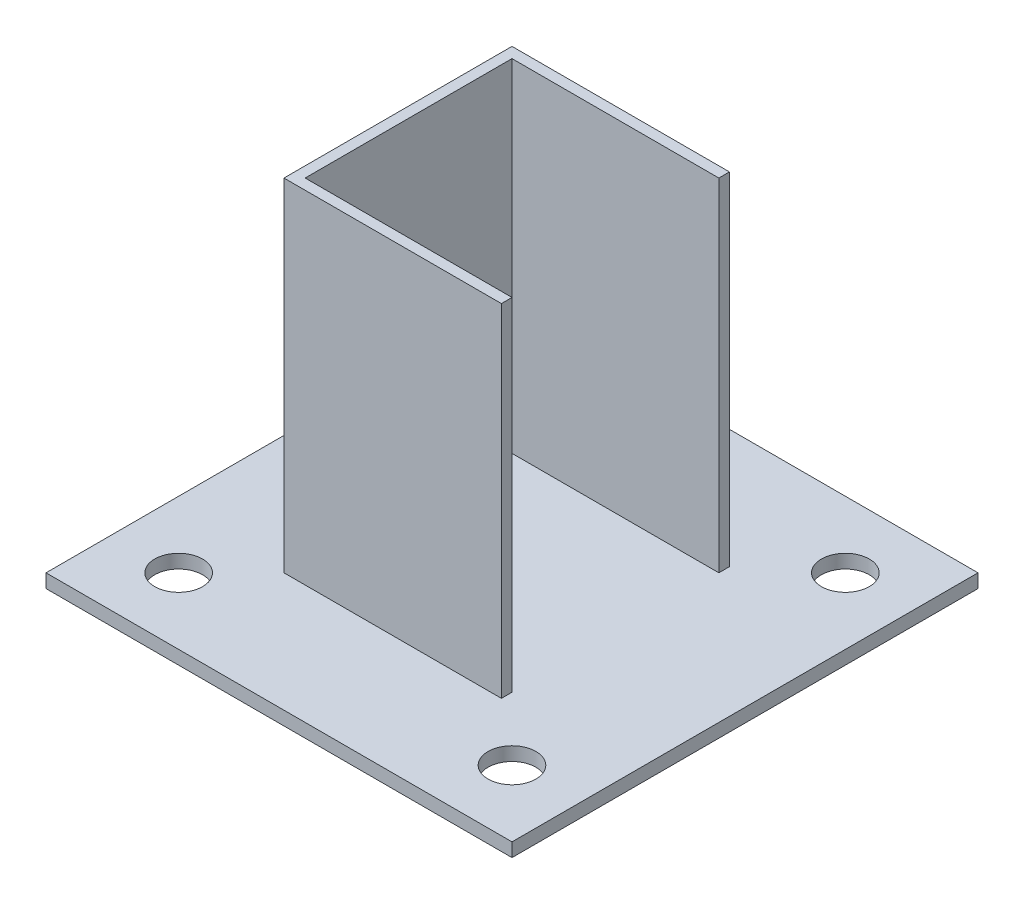
ISO-10303-21;
HEADER;
FILE_DESCRIPTION(('STEP AP214'),'2;1');
FILE_NAME('part.step','',(''),(''),'','','');
FILE_SCHEMA(('AUTOMOTIVE_DESIGN { 1 0 10303 214 1 1 1 1 }'));
ENDSEC;
DATA;
#1=APPLICATION_CONTEXT('core data for automotive mechanical design processes');
#2=APPLICATION_PROTOCOL_DEFINITION('international standard','automotive_design',2000,#1);
#3=PRODUCT_CONTEXT('',#1,'mechanical');
#4=PRODUCT('Part','Part','',(#3));
#5=PRODUCT_RELATED_PRODUCT_CATEGORY('part','',(#4));
#6=PRODUCT_DEFINITION_FORMATION('','',#4);
#7=PRODUCT_DEFINITION_CONTEXT('part definition',#1,'design');
#8=PRODUCT_DEFINITION('design','',#6,#7);
#9=PRODUCT_DEFINITION_SHAPE('','',#8);
#10=(LENGTH_UNIT() NAMED_UNIT(*) SI_UNIT(.MILLI.,.METRE.));
#11=(NAMED_UNIT(*) PLANE_ANGLE_UNIT() SI_UNIT($,.RADIAN.));
#12=(NAMED_UNIT(*) SI_UNIT($,.STERADIAN.) SOLID_ANGLE_UNIT());
#13=UNCERTAINTY_MEASURE_WITH_UNIT(LENGTH_MEASURE(1.E-05),#10,'distance_accuracy_value','');
#14=(GEOMETRIC_REPRESENTATION_CONTEXT(3) GLOBAL_UNCERTAINTY_ASSIGNED_CONTEXT((#13)) GLOBAL_UNIT_ASSIGNED_CONTEXT((#10,
#11,#12)) REPRESENTATION_CONTEXT('',''));
#15=CARTESIAN_POINT('',(0.,0.,0.));
#16=DIRECTION('',(0.,0.,1.));
#17=DIRECTION('',(1.,0.,0.));
#18=AXIS2_PLACEMENT_3D('',#15,#16,#17);
#19=CARTESIAN_POINT('',(-33.35,104.,1.55));
#20=DIRECTION('',(0.,0.,-1.));
#21=DIRECTION('',(-1.,0.,0.));
#22=AXIS2_PLACEMENT_3D('',#19,#20,#21);
#23=PLANE('',#22);
#24=DIRECTION('',(0.409248529410093,0.912422950815945,0.));
#25=VECTOR('',#24,1.);
#26=CARTESIAN_POINT('',(-63.85,4.,1.55));
#27=LINE('',#26,#25);
#28=CARTESIAN_POINT('',(-63.85,4.,1.55));
#29=VERTEX_POINT('',#28);
#30=CARTESIAN_POINT('',(-33.35,72.,1.55));
#31=VERTEX_POINT('',#30);
#32=EDGE_CURVE('E150',#29,#31,#27,.T.);
#33=ORIENTED_EDGE('',*,*,#32,.F.);
#34=DIRECTION('',(1.,0.,0.));
#35=VECTOR('',#34,1.);
#36=CARTESIAN_POINT('',(-33.35,4.,1.55));
#37=LINE('',#36,#35);
#38=CARTESIAN_POINT('',(-33.35,4.,1.55));
#39=VERTEX_POINT('',#38);
#40=EDGE_CURVE('E152',#29,#39,#37,.T.);
#41=ORIENTED_EDGE('',*,*,#40,.T.);
#42=DIRECTION('',(0.,-1.,0.));
#43=VECTOR('',#42,1.);
#44=CARTESIAN_POINT('',(-33.35,104.,1.55));
#45=LINE('',#44,#43);
#46=EDGE_CURVE('E156',#31,#39,#45,.T.);
#47=ORIENTED_EDGE('',*,*,#46,.F.);
#48=EDGE_LOOP('',(#33,#41,#47));
#49=FACE_BOUND('',#48,.T.);
#50=ADVANCED_FACE('F39',(#49),#23,.F.);
#51=CARTESIAN_POINT('',(68.15,4.,-68.15));
#52=DIRECTION('',(-1.,0.,0.));
#53=DIRECTION('',(0.,0.,1.));
#54=AXIS2_PLACEMENT_3D('',#51,#52,#53);
#55=PLANE('',#54);
#56=DIRECTION('',(0.,0.,-1.));
#57=VECTOR('',#56,1.);
#58=CARTESIAN_POINT('',(68.15,0.,-68.15));
#59=LINE('',#58,#57);
#60=CARTESIAN_POINT('',(68.15,0.,68.15));
#61=VERTEX_POINT('',#60);
#62=CARTESIAN_POINT('',(68.15,0.,-68.15));
#63=VERTEX_POINT('',#62);
#64=EDGE_CURVE('E208',#61,#63,#59,.T.);
#65=ORIENTED_EDGE('',*,*,#64,.T.);
#66=DIRECTION('',(0.,-1.,0.));
#67=VECTOR('',#66,1.);
#68=CARTESIAN_POINT('',(68.15,4.,-68.15));
#69=LINE('',#68,#67);
#70=CARTESIAN_POINT('',(68.15,4.,-68.15));
#71=VERTEX_POINT('',#70);
#72=EDGE_CURVE('E48',#71,#63,#69,.T.);
#73=ORIENTED_EDGE('',*,*,#72,.F.);
#74=DIRECTION('',(0.,0.,-1.));
#75=VECTOR('',#74,1.);
#76=CARTESIAN_POINT('',(68.15,4.,-68.15));
#77=LINE('',#76,#75);
#78=CARTESIAN_POINT('',(68.15,4.,68.15));
#79=VERTEX_POINT('',#78);
#80=EDGE_CURVE('E212',#79,#71,#77,.T.);
#81=ORIENTED_EDGE('',*,*,#80,.F.);
#82=DIRECTION('',(0.,-1.,0.));
#83=VECTOR('',#82,1.);
#84=CARTESIAN_POINT('',(68.15,4.,68.15));
#85=LINE('',#84,#83);
#86=EDGE_CURVE('E224',#79,#61,#85,.T.);
#87=ORIENTED_EDGE('',*,*,#86,.T.);
#88=EDGE_LOOP('',(#65,#73,#81,#87));
#89=FACE_BOUND('',#88,.T.);
#90=ADVANCED_FACE('F41',(#89),#55,.F.);
#91=CARTESIAN_POINT('',(-68.15,4.,-68.15));
#92=DIRECTION('',(0.,0.,1.));
#93=DIRECTION('',(1.,0.,0.));
#94=AXIS2_PLACEMENT_3D('',#91,#92,#93);
#95=PLANE('',#94);
#96=DIRECTION('',(-1.,0.,0.));
#97=VECTOR('',#96,1.);
#98=CARTESIAN_POINT('',(-68.15,0.,-68.15));
#99=LINE('',#98,#97);
#100=CARTESIAN_POINT('',(-68.15,0.,-68.15));
#101=VERTEX_POINT('',#100);
#102=EDGE_CURVE('E223',#63,#101,#99,.T.);
#103=ORIENTED_EDGE('',*,*,#102,.T.);
#104=DIRECTION('',(0.,-1.,0.));
#105=VECTOR('',#104,1.);
#106=CARTESIAN_POINT('',(-68.15,4.,-68.15));
#107=LINE('',#106,#105);
#108=CARTESIAN_POINT('',(-68.15,4.,-68.15));
#109=VERTEX_POINT('',#108);
#110=EDGE_CURVE('E234',#109,#101,#107,.T.);
#111=ORIENTED_EDGE('',*,*,#110,.F.);
#112=DIRECTION('',(-1.,0.,0.));
#113=VECTOR('',#112,1.);
#114=CARTESIAN_POINT('',(-68.15,4.,-68.15));
#115=LINE('',#114,#113);
#116=EDGE_CURVE('E211',#71,#109,#115,.T.);
#117=ORIENTED_EDGE('',*,*,#116,.F.);
#118=ORIENTED_EDGE('',*,*,#72,.T.);
#119=EDGE_LOOP('',(#103,#111,#117,#118));
#120=FACE_BOUND('',#119,.T.);
#121=ADVANCED_FACE('F272',(#120),#95,.F.);
#122=CARTESIAN_POINT('',(-68.15,4.,-68.15));
#123=DIRECTION('',(1.,0.,0.));
#124=DIRECTION('',(0.,0.,-1.));
#125=AXIS2_PLACEMENT_3D('',#122,#123,#124);
#126=PLANE('',#125);
#127=DIRECTION('',(0.,0.,1.));
#128=VECTOR('',#127,1.);
#129=CARTESIAN_POINT('',(-68.15,0.,-68.15));
#130=LINE('',#129,#128);
#131=CARTESIAN_POINT('',(-68.15,0.,68.15));
#132=VERTEX_POINT('',#131);
#133=EDGE_CURVE('E228',#101,#132,#130,.T.);
#134=ORIENTED_EDGE('',*,*,#133,.T.);
#135=DIRECTION('',(0.,-1.,0.));
#136=VECTOR('',#135,1.);
#137=CARTESIAN_POINT('',(-68.15,4.,68.15));
#138=LINE('',#137,#136);
#139=CARTESIAN_POINT('',(-68.15,4.,68.15));
#140=VERTEX_POINT('',#139);
#141=EDGE_CURVE('E232',#140,#132,#138,.T.);
#142=ORIENTED_EDGE('',*,*,#141,.F.);
#143=DIRECTION('',(0.,0.,1.));
#144=VECTOR('',#143,1.);
#145=CARTESIAN_POINT('',(-68.15,4.,-68.15));
#146=LINE('',#145,#144);
#147=EDGE_CURVE('E216',#109,#140,#146,.T.);
#148=ORIENTED_EDGE('',*,*,#147,.F.);
#149=ORIENTED_EDGE('',*,*,#110,.T.);
#150=EDGE_LOOP('',(#134,#142,#148,#149));
#151=FACE_BOUND('',#150,.T.);
#152=ADVANCED_FACE('F305',(#151),#126,.F.);
#153=CARTESIAN_POINT('',(-68.15,4.,68.15));
#154=DIRECTION('',(0.,0.,-1.));
#155=DIRECTION('',(-1.,0.,0.));
#156=AXIS2_PLACEMENT_3D('',#153,#154,#155);
#157=PLANE('',#156);
#158=DIRECTION('',(1.,0.,0.));
#159=VECTOR('',#158,1.);
#160=CARTESIAN_POINT('',(-68.15,0.,68.15));
#161=LINE('',#160,#159);
#162=EDGE_CURVE('E213',#132,#61,#161,.T.);
#163=ORIENTED_EDGE('',*,*,#162,.T.);
#164=ORIENTED_EDGE('',*,*,#86,.F.);
#165=DIRECTION('',(1.,0.,0.));
#166=VECTOR('',#165,1.);
#167=CARTESIAN_POINT('',(-68.15,4.,68.15));
#168=LINE('',#167,#166);
#169=EDGE_CURVE('E218',#140,#79,#168,.T.);
#170=ORIENTED_EDGE('',*,*,#169,.F.);
#171=ORIENTED_EDGE('',*,*,#141,.T.);
#172=EDGE_LOOP('',(#163,#164,#170,#171));
#173=FACE_BOUND('',#172,.T.);
#174=ADVANCED_FACE('F300',(#173),#157,.F.);
#175=CARTESIAN_POINT('',(0.,4.,0.));
#176=DIRECTION('',(0.,1.,0.));
#177=DIRECTION('',(0.,0.,1.));
#178=AXIS2_PLACEMENT_3D('',#175,#176,#177);
#179=PLANE('',#178);
#180=CARTESIAN_POINT('',(-48.7499999999995,4.,-48.7500000000005));
#181=DIRECTION('',(0.,1.,0.));
#182=DIRECTION('',(0.,0.,1.));
#183=AXIS2_PLACEMENT_3D('',#180,#181,#182);
#184=CIRCLE('',#183,7.);
#185=CARTESIAN_POINT('',(-48.7499999999995,4.,-41.7500000000005));
#186=VERTEX_POINT('',#185);
#187=EDGE_CURVE('E529',#186,#186,#184,.T.);
#188=ORIENTED_EDGE('',*,*,#187,.F.);
#189=EDGE_LOOP('',(#188));
#190=FACE_BOUND('',#189,.T.);
#191=CARTESIAN_POINT('',(-48.7500000000004,4.,48.7499999999996));
#192=DIRECTION('',(0.,1.,0.));
#193=DIRECTION('',(0.,0.,1.));
#194=AXIS2_PLACEMENT_3D('',#191,#192,#193);
#195=CIRCLE('',#194,7.);
#196=CARTESIAN_POINT('',(-48.7500000000004,4.,55.7499999999996));
#197=VERTEX_POINT('',#196);
#198=EDGE_CURVE('E530',#197,#197,#195,.T.);
#199=ORIENTED_EDGE('',*,*,#198,.F.);
#200=EDGE_LOOP('',(#199));
#201=FACE_BOUND('',#200,.T.);
#202=CARTESIAN_POINT('',(48.7499999999998,4.,48.7500000000002));
#203=DIRECTION('',(0.,1.,0.));
#204=DIRECTION('',(0.,0.,1.));
#205=AXIS2_PLACEMENT_3D('',#202,#203,#204);
#206=CIRCLE('',#205,7.);
#207=CARTESIAN_POINT('',(48.7499999999998,4.,55.7500000000002));
#208=VERTEX_POINT('',#207);
#209=EDGE_CURVE('E528',#208,#208,#206,.T.);
#210=ORIENTED_EDGE('',*,*,#209,.F.);
#211=EDGE_LOOP('',(#210));
#212=FACE_BOUND('',#211,.T.);
#213=CARTESIAN_POINT('',(48.75,4.,-48.75));
#214=DIRECTION('',(0.,1.,0.));
#215=DIRECTION('',(0.,0.,1.));
#216=AXIS2_PLACEMENT_3D('',#213,#214,#215);
#217=CIRCLE('',#216,7.);
#218=CARTESIAN_POINT('',(48.75,4.,-41.75));
#219=VERTEX_POINT('',#218);
#220=EDGE_CURVE('E245',#219,#219,#217,.T.);
#221=ORIENTED_EDGE('',*,*,#220,.F.);
#222=EDGE_LOOP('',(#221));
#223=FACE_BOUND('',#222,.T.);
#224=ORIENTED_EDGE('',*,*,#116,.T.);
#225=ORIENTED_EDGE('',*,*,#147,.T.);
#226=ORIENTED_EDGE('',*,*,#169,.T.);
#227=ORIENTED_EDGE('',*,*,#80,.T.);
#228=EDGE_LOOP('',(#224,#225,#226,#227));
#229=FACE_BOUND('',#228,.T.);
#230=DIRECTION('',(0.,0.,-1.));
#231=VECTOR('',#230,1.);
#232=CARTESIAN_POINT('',(30.25,4.,-33.35));
#233=LINE('',#232,#231);
#234=CARTESIAN_POINT('',(30.25,4.,-30.25));
#235=VERTEX_POINT('',#234);
#236=CARTESIAN_POINT('',(30.25,4.,-33.35));
#237=VERTEX_POINT('',#236);
#238=EDGE_CURVE('E64',#235,#237,#233,.T.);
#239=ORIENTED_EDGE('',*,*,#238,.F.);
#240=DIRECTION('',(1.,0.,0.));
#241=VECTOR('',#240,1.);
#242=CARTESIAN_POINT('',(30.25,4.,-30.25));
#243=LINE('',#242,#241);
#244=CARTESIAN_POINT('',(-30.25,4.,-30.25));
#245=VERTEX_POINT('',#244);
#246=EDGE_CURVE('E176',#245,#235,#243,.T.);
#247=ORIENTED_EDGE('',*,*,#246,.F.);
#248=DIRECTION('',(0.,0.,-1.));
#249=VECTOR('',#248,1.);
#250=CARTESIAN_POINT('',(-30.25,4.,-30.25));
#251=LINE('',#250,#249);
#252=CARTESIAN_POINT('',(-30.25,4.,30.25));
#253=VERTEX_POINT('',#252);
#254=EDGE_CURVE('E179',#253,#245,#251,.T.);
#255=ORIENTED_EDGE('',*,*,#254,.F.);
#256=DIRECTION('',(-1.,0.,0.));
#257=VECTOR('',#256,1.);
#258=CARTESIAN_POINT('',(-30.25,4.,30.25));
#259=LINE('',#258,#257);
#260=CARTESIAN_POINT('',(30.25,4.,30.25));
#261=VERTEX_POINT('',#260);
#262=EDGE_CURVE('E173',#261,#253,#259,.T.);
#263=ORIENTED_EDGE('',*,*,#262,.F.);
#264=DIRECTION('',(0.,0.,-1.));
#265=VECTOR('',#264,1.);
#266=CARTESIAN_POINT('',(30.25,4.,30.25));
#267=LINE('',#266,#265);
#268=CARTESIAN_POINT('',(30.25,4.,33.35));
#269=VERTEX_POINT('',#268);
#270=EDGE_CURVE('E174',#269,#261,#267,.T.);
#271=ORIENTED_EDGE('',*,*,#270,.F.);
#272=DIRECTION('',(1.,0.,0.));
#273=VECTOR('',#272,1.);
#274=CARTESIAN_POINT('',(30.25,4.,33.35));
#275=LINE('',#274,#273);
#276=CARTESIAN_POINT('',(-33.35,4.,33.35));
#277=VERTEX_POINT('',#276);
#278=EDGE_CURVE('E163',#277,#269,#275,.T.);
#279=ORIENTED_EDGE('',*,*,#278,.F.);
#280=DIRECTION('',(0.,0.,1.));
#281=VECTOR('',#280,1.);
#282=CARTESIAN_POINT('',(-33.35,4.,33.35));
#283=LINE('',#282,#281);
#284=EDGE_CURVE('E164',#39,#277,#283,.T.);
#285=ORIENTED_EDGE('',*,*,#284,.F.);
#286=ORIENTED_EDGE('',*,*,#40,.F.);
#287=DIRECTION('',(0.,0.,1.));
#288=VECTOR('',#287,1.);
#289=CARTESIAN_POINT('',(-63.85,4.,-1.54999999999999));
#290=LINE('',#289,#288);
#291=CARTESIAN_POINT('',(-63.85,4.,-1.55));
#292=VERTEX_POINT('',#291);
#293=EDGE_CURVE('E142',#292,#29,#290,.T.);
#294=ORIENTED_EDGE('',*,*,#293,.F.);
#295=DIRECTION('',(-1.,0.,0.));
#296=VECTOR('',#295,1.);
#297=CARTESIAN_POINT('',(-33.35,4.,-1.55));
#298=LINE('',#297,#296);
#299=CARTESIAN_POINT('',(-33.35,4.,-1.55));
#300=VERTEX_POINT('',#299);
#301=EDGE_CURVE('E155',#300,#292,#298,.T.);
#302=ORIENTED_EDGE('',*,*,#301,.F.);
#303=DIRECTION('',(0.,0.,1.));
#304=VECTOR('',#303,1.);
#305=CARTESIAN_POINT('',(-33.35,4.,-1.55));
#306=LINE('',#305,#304);
#307=CARTESIAN_POINT('',(-33.35,4.,-33.35));
#308=VERTEX_POINT('',#307);
#309=EDGE_CURVE('E504',#308,#300,#306,.T.);
#310=ORIENTED_EDGE('',*,*,#309,.F.);
#311=DIRECTION('',(-1.,0.,0.));
#312=VECTOR('',#311,1.);
#313=CARTESIAN_POINT('',(-33.35,4.,-33.35));
#314=LINE('',#313,#312);
#315=EDGE_CURVE('E505',#237,#308,#314,.T.);
#316=ORIENTED_EDGE('',*,*,#315,.F.);
#317=EDGE_LOOP('',(#239,#247,#255,#263,#271,#279,#285,#286,#294,#302,#310,#316));
#318=FACE_BOUND('',#317,.T.);
#319=ADVANCED_FACE('F162',(#190,#201,#212,#223,#229,#318),#179,.T.);
#320=CARTESIAN_POINT('',(0.,0.,0.));
#321=DIRECTION('',(0.,1.,0.));
#322=DIRECTION('',(0.,0.,1.));
#323=AXIS2_PLACEMENT_3D('',#320,#321,#322);
#324=PLANE('',#323);
#325=CARTESIAN_POINT('',(-48.7499999999995,0.,-48.7500000000005));
#326=DIRECTION('',(0.,1.,0.));
#327=DIRECTION('',(0.,0.,1.));
#328=AXIS2_PLACEMENT_3D('',#325,#326,#327);
#329=CIRCLE('',#328,7.);
#330=CARTESIAN_POINT('',(-48.7499999999995,0.,-41.7500000000005));
#331=VERTEX_POINT('',#330);
#332=EDGE_CURVE('E43',#331,#331,#329,.T.);
#333=ORIENTED_EDGE('',*,*,#332,.T.);
#334=EDGE_LOOP('',(#333));
#335=FACE_BOUND('',#334,.T.);
#336=CARTESIAN_POINT('',(-48.7500000000004,0.,48.7499999999996));
#337=DIRECTION('',(0.,1.,0.));
#338=DIRECTION('',(0.,0.,1.));
#339=AXIS2_PLACEMENT_3D('',#336,#337,#338);
#340=CIRCLE('',#339,7.);
#341=CARTESIAN_POINT('',(-48.7500000000004,0.,55.7499999999996));
#342=VERTEX_POINT('',#341);
#343=EDGE_CURVE('E242',#342,#342,#340,.T.);
#344=ORIENTED_EDGE('',*,*,#343,.T.);
#345=EDGE_LOOP('',(#344));
#346=FACE_BOUND('',#345,.T.);
#347=CARTESIAN_POINT('',(48.7499999999998,0.,48.7500000000002));
#348=DIRECTION('',(0.,1.,0.));
#349=DIRECTION('',(0.,0.,1.));
#350=AXIS2_PLACEMENT_3D('',#347,#348,#349);
#351=CIRCLE('',#350,7.);
#352=CARTESIAN_POINT('',(48.7499999999998,0.,55.7500000000002));
#353=VERTEX_POINT('',#352);
#354=EDGE_CURVE('E241',#353,#353,#351,.T.);
#355=ORIENTED_EDGE('',*,*,#354,.T.);
#356=EDGE_LOOP('',(#355));
#357=FACE_BOUND('',#356,.T.);
#358=CARTESIAN_POINT('',(48.75,0.,-48.75));
#359=DIRECTION('',(0.,1.,0.));
#360=DIRECTION('',(0.,0.,1.));
#361=AXIS2_PLACEMENT_3D('',#358,#359,#360);
#362=CIRCLE('',#361,7.);
#363=CARTESIAN_POINT('',(48.75,0.,-41.75));
#364=VERTEX_POINT('',#363);
#365=EDGE_CURVE('E236',#364,#364,#362,.T.);
#366=ORIENTED_EDGE('',*,*,#365,.T.);
#367=EDGE_LOOP('',(#366));
#368=FACE_BOUND('',#367,.T.);
#369=ORIENTED_EDGE('',*,*,#64,.F.);
#370=ORIENTED_EDGE('',*,*,#162,.F.);
#371=ORIENTED_EDGE('',*,*,#133,.F.);
#372=ORIENTED_EDGE('',*,*,#102,.F.);
#373=EDGE_LOOP('',(#369,#370,#371,#372));
#374=FACE_BOUND('',#373,.T.);
#375=ADVANCED_FACE('F254',(#335,#346,#357,#368,#374),#324,.F.);
#376=CARTESIAN_POINT('',(30.25,104.,-33.35));
#377=DIRECTION('',(-1.,0.,0.));
#378=DIRECTION('',(0.,0.,1.));
#379=AXIS2_PLACEMENT_3D('',#376,#377,#378);
#380=PLANE('',#379);
#381=ORIENTED_EDGE('',*,*,#238,.T.);
#382=DIRECTION('',(0.,-1.,0.));
#383=VECTOR('',#382,1.);
#384=CARTESIAN_POINT('',(30.25,104.,-33.35));
#385=LINE('',#384,#383);
#386=CARTESIAN_POINT('',(30.25,104.,-33.35));
#387=VERTEX_POINT('',#386);
#388=EDGE_CURVE('E210',#387,#237,#385,.T.);
#389=ORIENTED_EDGE('',*,*,#388,.F.);
#390=DIRECTION('',(0.,0.,-1.));
#391=VECTOR('',#390,1.);
#392=CARTESIAN_POINT('',(30.25,104.,-33.35));
#393=LINE('',#392,#391);
#394=CARTESIAN_POINT('',(30.25,104.,-30.25));
#395=VERTEX_POINT('',#394);
#396=EDGE_CURVE('E182',#395,#387,#393,.T.);
#397=ORIENTED_EDGE('',*,*,#396,.F.);
#398=DIRECTION('',(0.,-1.,0.));
#399=VECTOR('',#398,1.);
#400=CARTESIAN_POINT('',(30.25,104.,-30.25));
#401=LINE('',#400,#399);
#402=EDGE_CURVE('E181',#395,#235,#401,.T.);
#403=ORIENTED_EDGE('',*,*,#402,.T.);
#404=EDGE_LOOP('',(#381,#389,#397,#403));
#405=FACE_BOUND('',#404,.T.);
#406=ADVANCED_FACE('F294',(#405),#380,.F.);
#407=CARTESIAN_POINT('',(-33.35,104.,-33.35));
#408=DIRECTION('',(0.,0.,1.));
#409=DIRECTION('',(1.,0.,0.));
#410=AXIS2_PLACEMENT_3D('',#407,#408,#409);
#411=PLANE('',#410);
#412=ORIENTED_EDGE('',*,*,#315,.T.);
#413=DIRECTION('',(0.,-1.,0.));
#414=VECTOR('',#413,1.);
#415=CARTESIAN_POINT('',(-33.35,104.,-33.35));
#416=LINE('',#415,#414);
#417=CARTESIAN_POINT('',(-33.35,104.,-33.35));
#418=VERTEX_POINT('',#417);
#419=EDGE_CURVE('E204',#418,#308,#416,.T.);
#420=ORIENTED_EDGE('',*,*,#419,.F.);
#421=DIRECTION('',(-1.,0.,0.));
#422=VECTOR('',#421,1.);
#423=CARTESIAN_POINT('',(-33.35,104.,-33.35));
#424=LINE('',#423,#422);
#425=EDGE_CURVE('E512',#387,#418,#424,.T.);
#426=ORIENTED_EDGE('',*,*,#425,.F.);
#427=ORIENTED_EDGE('',*,*,#388,.T.);
#428=EDGE_LOOP('',(#412,#420,#426,#427));
#429=FACE_BOUND('',#428,.T.);
#430=ADVANCED_FACE('F290',(#429),#411,.F.);
#431=CARTESIAN_POINT('',(-33.35,104.,-1.55));
#432=DIRECTION('',(1.,0.,0.));
#433=DIRECTION('',(0.,0.,-1.));
#434=AXIS2_PLACEMENT_3D('',#431,#432,#433);
#435=PLANE('',#434);
#436=ORIENTED_EDGE('',*,*,#419,.T.);
#437=ORIENTED_EDGE('',*,*,#309,.T.);
#438=DIRECTION('',(0.,-1.,0.));
#439=VECTOR('',#438,1.);
#440=CARTESIAN_POINT('',(-33.35,104.,-1.55));
#441=LINE('',#440,#439);
#442=CARTESIAN_POINT('',(-33.35,72.,-1.55));
#443=VERTEX_POINT('',#442);
#444=EDGE_CURVE('E202',#443,#300,#441,.T.);
#445=ORIENTED_EDGE('',*,*,#444,.F.);
#446=DIRECTION('',(0.,0.,1.));
#447=VECTOR('',#446,1.);
#448=CARTESIAN_POINT('',(-33.35,72.,-98.45));
#449=LINE('',#448,#447);
#450=EDGE_CURVE('E57',#443,#31,#449,.T.);
#451=ORIENTED_EDGE('',*,*,#450,.T.);
#452=ORIENTED_EDGE('',*,*,#46,.T.);
#453=ORIENTED_EDGE('',*,*,#284,.T.);
#454=DIRECTION('',(0.,-1.,0.));
#455=VECTOR('',#454,1.);
#456=CARTESIAN_POINT('',(-33.35,104.,33.35));
#457=LINE('',#456,#455);
#458=CARTESIAN_POINT('',(-33.35,104.,33.35));
#459=VERTEX_POINT('',#458);
#460=EDGE_CURVE('E197',#459,#277,#457,.T.);
#461=ORIENTED_EDGE('',*,*,#460,.F.);
#462=DIRECTION('',(0.,0.,1.));
#463=VECTOR('',#462,1.);
#464=CARTESIAN_POINT('',(-33.35,104.,-1.55));
#465=LINE('',#464,#463);
#466=EDGE_CURVE('E494',#418,#459,#465,.T.);
#467=ORIENTED_EDGE('',*,*,#466,.F.);
#468=EDGE_LOOP('',(#436,#437,#445,#451,#452,#453,#461,#467));
#469=FACE_BOUND('',#468,.T.);
#470=ADVANCED_FACE('F284',(#469),#435,.F.);
#471=CARTESIAN_POINT('',(-33.35,104.,-1.55));
#472=DIRECTION('',(0.,0.,1.));
#473=DIRECTION('',(1.,0.,0.));
#474=AXIS2_PLACEMENT_3D('',#471,#472,#473);
#475=PLANE('',#474);
#476=ORIENTED_EDGE('',*,*,#301,.T.);
#477=DIRECTION('',(0.409248529410093,0.912422950815945,0.));
#478=VECTOR('',#477,1.);
#479=CARTESIAN_POINT('',(-21.4009519737138,98.6405005176217,-1.55));
#480=LINE('',#479,#478);
#481=EDGE_CURVE('E11',#292,#443,#480,.T.);
#482=ORIENTED_EDGE('',*,*,#481,.T.);
#483=ORIENTED_EDGE('',*,*,#444,.T.);
#484=EDGE_LOOP('',(#476,#482,#483));
#485=FACE_BOUND('',#484,.T.);
#486=ADVANCED_FACE('F279',(#485),#475,.F.);
#487=CARTESIAN_POINT('',(30.25,104.,33.35));
#488=DIRECTION('',(0.,0.,-1.));
#489=DIRECTION('',(-1.,0.,0.));
#490=AXIS2_PLACEMENT_3D('',#487,#488,#489);
#491=PLANE('',#490);
#492=ORIENTED_EDGE('',*,*,#278,.T.);
#493=DIRECTION('',(0.,-1.,0.));
#494=VECTOR('',#493,1.);
#495=CARTESIAN_POINT('',(30.25,104.,33.35));
#496=LINE('',#495,#494);
#497=CARTESIAN_POINT('',(30.25,104.,33.35));
#498=VERTEX_POINT('',#497);
#499=EDGE_CURVE('E196',#498,#269,#496,.T.);
#500=ORIENTED_EDGE('',*,*,#499,.F.);
#501=DIRECTION('',(1.,0.,0.));
#502=VECTOR('',#501,1.);
#503=CARTESIAN_POINT('',(30.25,104.,33.35));
#504=LINE('',#503,#502);
#505=EDGE_CURVE('E491',#459,#498,#504,.T.);
#506=ORIENTED_EDGE('',*,*,#505,.F.);
#507=ORIENTED_EDGE('',*,*,#460,.T.);
#508=EDGE_LOOP('',(#492,#500,#506,#507));
#509=FACE_BOUND('',#508,.T.);
#510=ADVANCED_FACE('F277',(#509),#491,.F.);
#511=CARTESIAN_POINT('',(30.25,104.,30.25));
#512=DIRECTION('',(-1.,0.,0.));
#513=DIRECTION('',(0.,0.,1.));
#514=AXIS2_PLACEMENT_3D('',#511,#512,#513);
#515=PLANE('',#514);
#516=ORIENTED_EDGE('',*,*,#270,.T.);
#517=DIRECTION('',(0.,-1.,0.));
#518=VECTOR('',#517,1.);
#519=CARTESIAN_POINT('',(30.25,104.,30.25));
#520=LINE('',#519,#518);
#521=CARTESIAN_POINT('',(30.25,104.,30.25));
#522=VERTEX_POINT('',#521);
#523=EDGE_CURVE('E193',#522,#261,#520,.T.);
#524=ORIENTED_EDGE('',*,*,#523,.F.);
#525=DIRECTION('',(0.,0.,-1.));
#526=VECTOR('',#525,1.);
#527=CARTESIAN_POINT('',(30.25,104.,30.25));
#528=LINE('',#527,#526);
#529=EDGE_CURVE('E486',#498,#522,#528,.T.);
#530=ORIENTED_EDGE('',*,*,#529,.F.);
#531=ORIENTED_EDGE('',*,*,#499,.T.);
#532=EDGE_LOOP('',(#516,#524,#530,#531));
#533=FACE_BOUND('',#532,.T.);
#534=ADVANCED_FACE('F429',(#533),#515,.F.);
#535=CARTESIAN_POINT('',(-30.25,104.,30.25));
#536=DIRECTION('',(0.,0.,1.));
#537=DIRECTION('',(1.,0.,0.));
#538=AXIS2_PLACEMENT_3D('',#535,#536,#537);
#539=PLANE('',#538);
#540=ORIENTED_EDGE('',*,*,#262,.T.);
#541=DIRECTION('',(0.,-1.,0.));
#542=VECTOR('',#541,1.);
#543=CARTESIAN_POINT('',(-30.25,104.,30.25));
#544=LINE('',#543,#542);
#545=CARTESIAN_POINT('',(-30.25,104.,30.25));
#546=VERTEX_POINT('',#545);
#547=EDGE_CURVE('E187',#546,#253,#544,.T.);
#548=ORIENTED_EDGE('',*,*,#547,.F.);
#549=DIRECTION('',(-1.,0.,0.));
#550=VECTOR('',#549,1.);
#551=CARTESIAN_POINT('',(-30.25,104.,30.25));
#552=LINE('',#551,#550);
#553=EDGE_CURVE('E487',#522,#546,#552,.T.);
#554=ORIENTED_EDGE('',*,*,#553,.F.);
#555=ORIENTED_EDGE('',*,*,#523,.T.);
#556=EDGE_LOOP('',(#540,#548,#554,#555));
#557=FACE_BOUND('',#556,.T.);
#558=ADVANCED_FACE('F421',(#557),#539,.F.);
#559=CARTESIAN_POINT('',(-30.25,104.,-30.25));
#560=DIRECTION('',(-1.,0.,0.));
#561=DIRECTION('',(0.,0.,1.));
#562=AXIS2_PLACEMENT_3D('',#559,#560,#561);
#563=PLANE('',#562);
#564=ORIENTED_EDGE('',*,*,#254,.T.);
#565=DIRECTION('',(0.,-1.,0.));
#566=VECTOR('',#565,1.);
#567=CARTESIAN_POINT('',(-30.25,104.,-30.25));
#568=LINE('',#567,#566);
#569=CARTESIAN_POINT('',(-30.25,104.,-30.25));
#570=VERTEX_POINT('',#569);
#571=EDGE_CURVE('E188',#570,#245,#568,.T.);
#572=ORIENTED_EDGE('',*,*,#571,.F.);
#573=DIRECTION('',(0.,0.,-1.));
#574=VECTOR('',#573,1.);
#575=CARTESIAN_POINT('',(-30.25,104.,-30.25));
#576=LINE('',#575,#574);
#577=EDGE_CURVE('E493',#546,#570,#576,.T.);
#578=ORIENTED_EDGE('',*,*,#577,.F.);
#579=ORIENTED_EDGE('',*,*,#547,.T.);
#580=EDGE_LOOP('',(#564,#572,#578,#579));
#581=FACE_BOUND('',#580,.T.);
#582=ADVANCED_FACE('F415',(#581),#563,.F.);
#583=CARTESIAN_POINT('',(30.25,104.,-30.25));
#584=DIRECTION('',(0.,0.,-1.));
#585=DIRECTION('',(-1.,0.,0.));
#586=AXIS2_PLACEMENT_3D('',#583,#584,#585);
#587=PLANE('',#586);
#588=ORIENTED_EDGE('',*,*,#246,.T.);
#589=ORIENTED_EDGE('',*,*,#402,.F.);
#590=DIRECTION('',(1.,0.,0.));
#591=VECTOR('',#590,1.);
#592=CARTESIAN_POINT('',(30.25,104.,-30.25));
#593=LINE('',#592,#591);
#594=EDGE_CURVE('E190',#570,#395,#593,.T.);
#595=ORIENTED_EDGE('',*,*,#594,.F.);
#596=ORIENTED_EDGE('',*,*,#571,.T.);
#597=EDGE_LOOP('',(#588,#589,#595,#596));
#598=FACE_BOUND('',#597,.T.);
#599=ADVANCED_FACE('F355',(#598),#587,.F.);
#600=CARTESIAN_POINT('',(0.,104.,0.));
#601=DIRECTION('',(0.,-1.,0.));
#602=DIRECTION('',(0.,0.,-1.));
#603=AXIS2_PLACEMENT_3D('',#600,#601,#602);
#604=PLANE('',#603);
#605=ORIENTED_EDGE('',*,*,#466,.T.);
#606=ORIENTED_EDGE('',*,*,#505,.T.);
#607=ORIENTED_EDGE('',*,*,#529,.T.);
#608=ORIENTED_EDGE('',*,*,#553,.T.);
#609=ORIENTED_EDGE('',*,*,#577,.T.);
#610=ORIENTED_EDGE('',*,*,#594,.T.);
#611=ORIENTED_EDGE('',*,*,#396,.T.);
#612=ORIENTED_EDGE('',*,*,#425,.T.);
#613=EDGE_LOOP('',(#605,#606,#607,#608,#609,#610,#611,#612));
#614=FACE_BOUND('',#613,.T.);
#615=ADVANCED_FACE('F348',(#614),#604,.F.);
#616=CARTESIAN_POINT('',(-63.85,4.,-98.45));
#617=DIRECTION('',(0.912422950815945,-0.409248529410093,0.));
#618=DIRECTION('',(0.409248529410093,0.912422950815945,0.));
#619=AXIS2_PLACEMENT_3D('',#616,#617,#618);
#620=PLANE('',#619);
#621=ORIENTED_EDGE('',*,*,#293,.T.);
#622=ORIENTED_EDGE('',*,*,#32,.T.);
#623=ORIENTED_EDGE('',*,*,#450,.F.);
#624=ORIENTED_EDGE('',*,*,#481,.F.);
#625=EDGE_LOOP('',(#621,#622,#623,#624));
#626=FACE_BOUND('',#625,.T.);
#627=ADVANCED_FACE('F146',(#626),#620,.F.);
#628=CARTESIAN_POINT('',(48.75,-96.,-48.75));
#629=DIRECTION('',(0.,1.,0.));
#630=DIRECTION('',(0.,0.,1.));
#631=AXIS2_PLACEMENT_3D('',#628,#629,#630);
#632=CYLINDRICAL_SURFACE('',#631,7.);
#633=ORIENTED_EDGE('',*,*,#220,.T.);
#634=EDGE_LOOP('',(#633));
#635=FACE_BOUND('',#634,.T.);
#636=ORIENTED_EDGE('',*,*,#365,.F.);
#637=EDGE_LOOP('',(#636));
#638=FACE_BOUND('',#637,.T.);
#639=ADVANCED_FACE('F362',(#635,#638),#632,.F.);
#640=CARTESIAN_POINT('',(48.7499999999998,-96.,48.7500000000002));
#641=DIRECTION('',(0.,1.,0.));
#642=DIRECTION('',(0.,0.,1.));
#643=AXIS2_PLACEMENT_3D('',#640,#641,#642);
#644=CYLINDRICAL_SURFACE('',#643,7.);
#645=ORIENTED_EDGE('',*,*,#209,.T.);
#646=EDGE_LOOP('',(#645));
#647=FACE_BOUND('',#646,.T.);
#648=ORIENTED_EDGE('',*,*,#354,.F.);
#649=EDGE_LOOP('',(#648));
#650=FACE_BOUND('',#649,.T.);
#651=ADVANCED_FACE('F265',(#647,#650),#644,.F.);
#652=CARTESIAN_POINT('',(-48.7500000000004,-96.,48.7499999999996));
#653=DIRECTION('',(0.,1.,0.));
#654=DIRECTION('',(0.,0.,1.));
#655=AXIS2_PLACEMENT_3D('',#652,#653,#654);
#656=CYLINDRICAL_SURFACE('',#655,7.);
#657=ORIENTED_EDGE('',*,*,#198,.T.);
#658=EDGE_LOOP('',(#657));
#659=FACE_BOUND('',#658,.T.);
#660=ORIENTED_EDGE('',*,*,#343,.F.);
#661=EDGE_LOOP('',(#660));
#662=FACE_BOUND('',#661,.T.);
#663=ADVANCED_FACE('F258',(#659,#662),#656,.F.);
#664=CARTESIAN_POINT('',(-48.7499999999995,-96.,-48.7500000000005));
#665=DIRECTION('',(0.,1.,0.));
#666=DIRECTION('',(0.,0.,1.));
#667=AXIS2_PLACEMENT_3D('',#664,#665,#666);
#668=CYLINDRICAL_SURFACE('',#667,7.);
#669=ORIENTED_EDGE('',*,*,#187,.T.);
#670=EDGE_LOOP('',(#669));
#671=FACE_BOUND('',#670,.T.);
#672=ORIENTED_EDGE('',*,*,#332,.F.);
#673=EDGE_LOOP('',(#672));
#674=FACE_BOUND('',#673,.T.);
#675=ADVANCED_FACE('F255',(#671,#674),#668,.F.);
#676=CLOSED_SHELL('',(#50,#90,#121,#152,#174,#319,#375,#406,#430,#470,#486,#510,#534,#558,#582,
#599,#615,#627,#639,#651,#663,#675));
#677=MANIFOLD_SOLID_BREP('B2',#676);
#678=ADVANCED_BREP_SHAPE_REPRESENTATION('',(#18,#677),#14);
#679=SHAPE_DEFINITION_REPRESENTATION(#9,#678);
ENDSEC;
END-ISO-10303-21;
